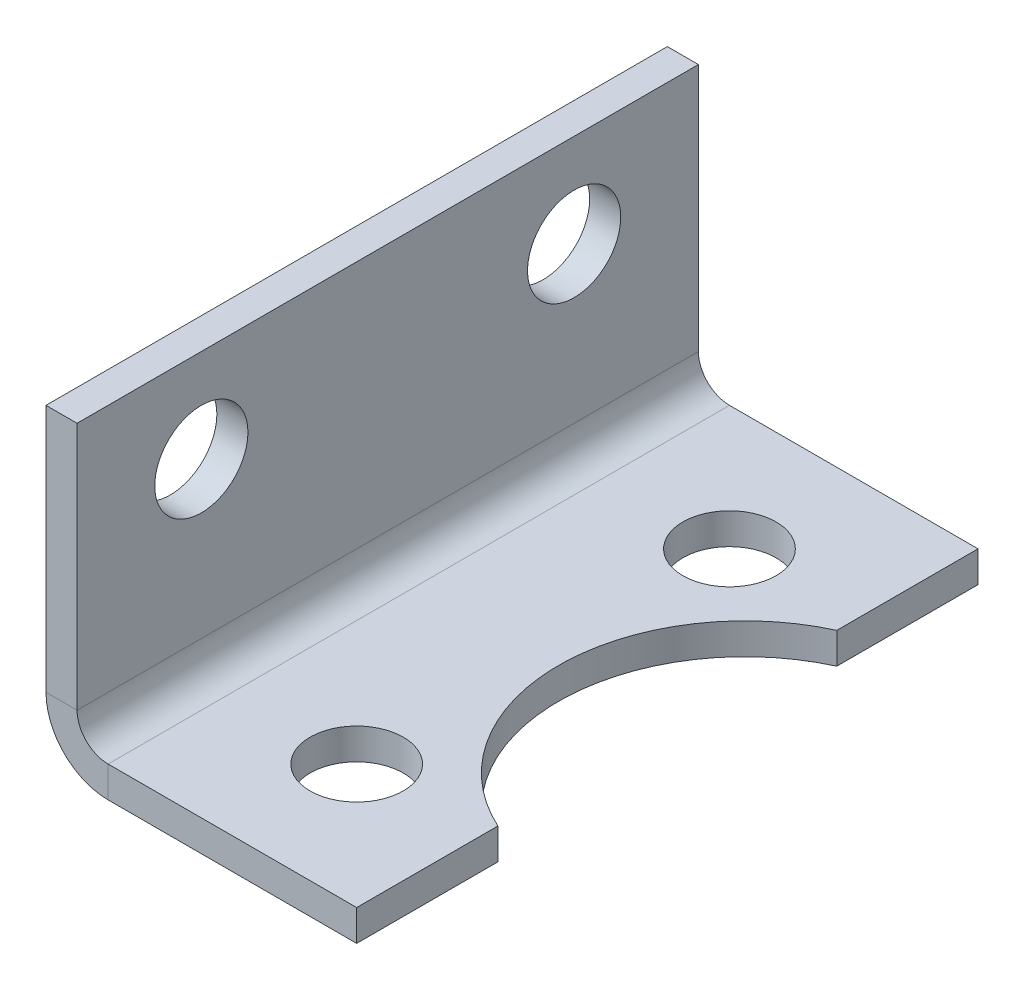
ISO-10303-21;
HEADER;
FILE_DESCRIPTION(('STEP AP214'),'2;1');
FILE_NAME('part.step','',(''),(''),'','','');
FILE_SCHEMA(('AUTOMOTIVE_DESIGN { 1 0 10303 214 1 1 1 1 }'));
ENDSEC;
DATA;
#1=APPLICATION_CONTEXT('core data for automotive mechanical design processes');
#2=APPLICATION_PROTOCOL_DEFINITION('international standard','automotive_design',2000,#1);
#3=PRODUCT_CONTEXT('',#1,'mechanical');
#4=PRODUCT('Part','Part','',(#3));
#5=PRODUCT_RELATED_PRODUCT_CATEGORY('part','',(#4));
#6=PRODUCT_DEFINITION_FORMATION('','',#4);
#7=PRODUCT_DEFINITION_CONTEXT('part definition',#1,'design');
#8=PRODUCT_DEFINITION('design','',#6,#7);
#9=PRODUCT_DEFINITION_SHAPE('','',#8);
#10=(LENGTH_UNIT() NAMED_UNIT(*) SI_UNIT(.MILLI.,.METRE.));
#11=(NAMED_UNIT(*) PLANE_ANGLE_UNIT() SI_UNIT($,.RADIAN.));
#12=(NAMED_UNIT(*) SI_UNIT($,.STERADIAN.) SOLID_ANGLE_UNIT());
#13=UNCERTAINTY_MEASURE_WITH_UNIT(LENGTH_MEASURE(1.E-05),#10,'distance_accuracy_value','');
#14=(GEOMETRIC_REPRESENTATION_CONTEXT(3) GLOBAL_UNCERTAINTY_ASSIGNED_CONTEXT((#13)) GLOBAL_UNIT_ASSIGNED_CONTEXT((#10,
#11,#12)) REPRESENTATION_CONTEXT('',''));
#15=CARTESIAN_POINT('',(0.,0.,0.));
#16=DIRECTION('',(0.,0.,1.));
#17=DIRECTION('',(1.,0.,0.));
#18=AXIS2_PLACEMENT_3D('',#15,#16,#17);
#19=CARTESIAN_POINT('',(18.,0.,40.));
#20=DIRECTION('',(1.,0.,0.));
#21=DIRECTION('',(0.,0.,-1.));
#22=AXIS2_PLACEMENT_3D('',#19,#20,#21);
#23=PLANE('',#22);
#24=DIRECTION('',(0.,1.,0.));
#25=VECTOR('',#24,1.);
#26=CARTESIAN_POINT('',(18.,-10.,9.09128788536431));
#27=LINE('',#26,#25);
#28=CARTESIAN_POINT('',(18.,-2.,9.09128788536431));
#29=VERTEX_POINT('',#28);
#30=CARTESIAN_POINT('',(18.,0.,9.09128788536431));
#31=VERTEX_POINT('',#30);
#32=EDGE_CURVE('E60',#29,#31,#27,.T.);
#33=ORIENTED_EDGE('',*,*,#32,.F.);
#34=DIRECTION('',(0.,0.,-1.));
#35=VECTOR('',#34,1.);
#36=CARTESIAN_POINT('',(18.,-2.,40.));
#37=LINE('',#36,#35);
#38=CARTESIAN_POINT('',(18.,-2.,0.));
#39=VERTEX_POINT('',#38);
#40=EDGE_CURVE('E191',#29,#39,#37,.T.);
#41=ORIENTED_EDGE('',*,*,#40,.T.);
#42=DIRECTION('',(0.,-1.,0.));
#43=VECTOR('',#42,1.);
#44=CARTESIAN_POINT('',(18.,0.,0.));
#45=LINE('',#44,#43);
#46=CARTESIAN_POINT('',(18.,0.,0.));
#47=VERTEX_POINT('',#46);
#48=EDGE_CURVE('E161',#47,#39,#45,.T.);
#49=ORIENTED_EDGE('',*,*,#48,.F.);
#50=DIRECTION('',(0.,0.,-1.));
#51=VECTOR('',#50,1.);
#52=CARTESIAN_POINT('',(18.,0.,40.));
#53=LINE('',#52,#51);
#54=EDGE_CURVE('E187',#31,#47,#53,.T.);
#55=ORIENTED_EDGE('',*,*,#54,.F.);
#56=EDGE_LOOP('',(#33,#41,#49,#55));
#57=FACE_BOUND('',#56,.T.);
#58=ADVANCED_FACE('F43',(#57),#23,.T.);
#59=CARTESIAN_POINT('',(2.,0.,40.));
#60=DIRECTION('',(0.,0.,1.));
#61=DIRECTION('',(1.,0.,0.));
#62=AXIS2_PLACEMENT_3D('',#59,#60,#61);
#63=PLANE('',#62);
#64=DIRECTION('',(0.,-1.,0.));
#65=VECTOR('',#64,1.);
#66=CARTESIAN_POINT('',(2.,0.,40.));
#67=LINE('',#66,#65);
#68=CARTESIAN_POINT('',(2.,0.,40.));
#69=VERTEX_POINT('',#68);
#70=CARTESIAN_POINT('',(2.,-2.,40.));
#71=VERTEX_POINT('',#70);
#72=EDGE_CURVE('E11',#69,#71,#67,.T.);
#73=ORIENTED_EDGE('',*,*,#72,.F.);
#74=CARTESIAN_POINT('',(2.,2.,40.));
#75=DIRECTION('',(0.,0.,-1.));
#76=DIRECTION('',(-1.,0.,0.));
#77=AXIS2_PLACEMENT_3D('',#74,#75,#76);
#78=CIRCLE('',#77,2.);
#79=CARTESIAN_POINT('',(0.,2.,40.));
#80=VERTEX_POINT('',#79);
#81=EDGE_CURVE('E152',#80,#69,#78,.F.);
#82=ORIENTED_EDGE('',*,*,#81,.F.);
#83=DIRECTION('',(1.,0.,0.));
#84=VECTOR('',#83,1.);
#85=CARTESIAN_POINT('',(-2.,2.,40.));
#86=LINE('',#85,#84);
#87=CARTESIAN_POINT('',(-2.,2.,40.));
#88=VERTEX_POINT('',#87);
#89=EDGE_CURVE('E52',#88,#80,#86,.T.);
#90=ORIENTED_EDGE('',*,*,#89,.F.);
#91=CARTESIAN_POINT('',(2.,2.,40.));
#92=DIRECTION('',(0.,0.,1.));
#93=DIRECTION('',(1.,0.,0.));
#94=AXIS2_PLACEMENT_3D('',#91,#92,#93);
#95=CIRCLE('',#94,4.);
#96=EDGE_CURVE('E145',#88,#71,#95,.T.);
#97=ORIENTED_EDGE('',*,*,#96,.T.);
#98=EDGE_LOOP('',(#73,#82,#90,#97));
#99=FACE_BOUND('',#98,.T.);
#100=ADVANCED_FACE('F45',(#99),#63,.T.);
#101=CARTESIAN_POINT('',(-2.,2.,40.));
#102=DIRECTION('',(0.,0.,1.));
#103=DIRECTION('',(1.,0.,0.));
#104=AXIS2_PLACEMENT_3D('',#101,#102,#103);
#105=PLANE('',#104);
#106=DIRECTION('',(1.,0.,0.));
#107=VECTOR('',#106,1.);
#108=CARTESIAN_POINT('',(0.,0.,40.));
#109=LINE('',#108,#107);
#110=CARTESIAN_POINT('',(18.,0.,40.));
#111=VERTEX_POINT('',#110);
#112=EDGE_CURVE('E219',#69,#111,#109,.T.);
#113=ORIENTED_EDGE('',*,*,#112,.F.);
#114=ORIENTED_EDGE('',*,*,#72,.T.);
#115=DIRECTION('',(1.,0.,0.));
#116=VECTOR('',#115,1.);
#117=CARTESIAN_POINT('',(0.,-2.,40.));
#118=LINE('',#117,#116);
#119=CARTESIAN_POINT('',(18.,-2.,40.));
#120=VERTEX_POINT('',#119);
#121=EDGE_CURVE('E107',#71,#120,#118,.T.);
#122=ORIENTED_EDGE('',*,*,#121,.T.);
#123=DIRECTION('',(0.,-1.,0.));
#124=VECTOR('',#123,1.);
#125=CARTESIAN_POINT('',(18.,0.,40.));
#126=LINE('',#125,#124);
#127=EDGE_CURVE('E216',#111,#120,#126,.T.);
#128=ORIENTED_EDGE('',*,*,#127,.F.);
#129=EDGE_LOOP('',(#113,#114,#122,#128));
#130=FACE_BOUND('',#129,.T.);
#131=ADVANCED_FACE('F240',(#130),#105,.T.);
#132=CARTESIAN_POINT('',(0.,2.,0.));
#133=DIRECTION('',(0.,0.,-1.));
#134=DIRECTION('',(-1.,0.,0.));
#135=AXIS2_PLACEMENT_3D('',#132,#133,#134);
#136=PLANE('',#135);
#137=DIRECTION('',(-1.,0.,0.));
#138=VECTOR('',#137,1.);
#139=CARTESIAN_POINT('',(0.,2.,0.));
#140=LINE('',#139,#138);
#141=CARTESIAN_POINT('',(0.,2.,0.));
#142=VERTEX_POINT('',#141);
#143=CARTESIAN_POINT('',(-2.,2.,0.));
#144=VERTEX_POINT('',#143);
#145=EDGE_CURVE('E196',#142,#144,#140,.T.);
#146=ORIENTED_EDGE('',*,*,#145,.F.);
#147=CARTESIAN_POINT('',(2.,2.,0.));
#148=DIRECTION('',(0.,0.,-1.));
#149=DIRECTION('',(-1.,0.,0.));
#150=AXIS2_PLACEMENT_3D('',#147,#148,#149);
#151=CIRCLE('',#150,2.);
#152=CARTESIAN_POINT('',(2.,0.,0.));
#153=VERTEX_POINT('',#152);
#154=EDGE_CURVE('E167',#142,#153,#151,.F.);
#155=ORIENTED_EDGE('',*,*,#154,.T.);
#156=DIRECTION('',(0.,1.,0.));
#157=VECTOR('',#156,1.);
#158=CARTESIAN_POINT('',(2.,-2.,0.));
#159=LINE('',#158,#157);
#160=CARTESIAN_POINT('',(2.,-2.,0.));
#161=VERTEX_POINT('',#160);
#162=EDGE_CURVE('E101',#161,#153,#159,.T.);
#163=ORIENTED_EDGE('',*,*,#162,.F.);
#164=CARTESIAN_POINT('',(2.,2.,0.));
#165=DIRECTION('',(0.,0.,1.));
#166=DIRECTION('',(1.,0.,0.));
#167=AXIS2_PLACEMENT_3D('',#164,#165,#166);
#168=CIRCLE('',#167,4.);
#169=EDGE_CURVE('E175',#144,#161,#168,.T.);
#170=ORIENTED_EDGE('',*,*,#169,.F.);
#171=EDGE_LOOP('',(#146,#155,#163,#170));
#172=FACE_BOUND('',#171,.T.);
#173=ADVANCED_FACE('F238',(#172),#136,.T.);
#174=CARTESIAN_POINT('',(2.,-2.,0.));
#175=DIRECTION('',(0.,0.,-1.));
#176=DIRECTION('',(-1.,0.,0.));
#177=AXIS2_PLACEMENT_3D('',#174,#175,#176);
#178=PLANE('',#177);
#179=DIRECTION('',(0.,-1.,0.));
#180=VECTOR('',#179,1.);
#181=CARTESIAN_POINT('',(0.,18.,0.));
#182=LINE('',#181,#180);
#183=CARTESIAN_POINT('',(0.,18.,0.));
#184=VERTEX_POINT('',#183);
#185=EDGE_CURVE('E169',#184,#142,#182,.T.);
#186=ORIENTED_EDGE('',*,*,#185,.T.);
#187=ORIENTED_EDGE('',*,*,#145,.T.);
#188=DIRECTION('',(0.,-1.,0.));
#189=VECTOR('',#188,1.);
#190=CARTESIAN_POINT('',(-2.,18.,0.));
#191=LINE('',#190,#189);
#192=CARTESIAN_POINT('',(-2.,18.,0.));
#193=VERTEX_POINT('',#192);
#194=EDGE_CURVE('E173',#193,#144,#191,.T.);
#195=ORIENTED_EDGE('',*,*,#194,.F.);
#196=DIRECTION('',(1.,0.,0.));
#197=VECTOR('',#196,1.);
#198=CARTESIAN_POINT('',(-2.,18.,0.));
#199=LINE('',#198,#197);
#200=EDGE_CURVE('E131',#193,#184,#199,.T.);
#201=ORIENTED_EDGE('',*,*,#200,.T.);
#202=EDGE_LOOP('',(#186,#187,#195,#201));
#203=FACE_BOUND('',#202,.T.);
#204=ADVANCED_FACE('F234',(#203),#178,.T.);
#205=CARTESIAN_POINT('',(0.,-2.,40.));
#206=DIRECTION('',(0.,1.,0.));
#207=DIRECTION('',(0.,0.,1.));
#208=AXIS2_PLACEMENT_3D('',#205,#206,#207);
#209=PLANE('',#208);
#210=CARTESIAN_POINT('',(10.,-2.,8.));
#211=DIRECTION('',(0.,1.,0.));
#212=DIRECTION('',(0.,0.,1.));
#213=AXIS2_PLACEMENT_3D('',#210,#211,#212);
#214=CIRCLE('',#213,3.);
#215=CARTESIAN_POINT('',(10.,-2.,11.));
#216=VERTEX_POINT('',#215);
#217=EDGE_CURVE('E210',#216,#216,#214,.T.);
#218=ORIENTED_EDGE('',*,*,#217,.T.);
#219=EDGE_LOOP('',(#218));
#220=FACE_BOUND('',#219,.T.);
#221=CARTESIAN_POINT('',(10.,-2.,32.));
#222=DIRECTION('',(0.,1.,0.));
#223=DIRECTION('',(0.,0.,1.));
#224=AXIS2_PLACEMENT_3D('',#221,#222,#223);
#225=CIRCLE('',#224,3.);
#226=CARTESIAN_POINT('',(10.,-2.,35.));
#227=VERTEX_POINT('',#226);
#228=EDGE_CURVE('E285',#227,#227,#225,.T.);
#229=ORIENTED_EDGE('',*,*,#228,.T.);
#230=EDGE_LOOP('',(#229));
#231=FACE_BOUND('',#230,.T.);
#232=ORIENTED_EDGE('',*,*,#40,.F.);
#233=CARTESIAN_POINT('',(23.,-2.,20.));
#234=DIRECTION('',(0.,1.,0.));
#235=DIRECTION('',(0.,0.,1.));
#236=AXIS2_PLACEMENT_3D('',#233,#234,#235);
#237=CIRCLE('',#236,12.);
#238=CARTESIAN_POINT('',(18.,-2.,30.9087121146357));
#239=VERTEX_POINT('',#238);
#240=EDGE_CURVE('E273',#29,#239,#237,.T.);
#241=ORIENTED_EDGE('',*,*,#240,.T.);
#242=EDGE_CURVE('E192',#120,#239,#37,.T.);
#243=ORIENTED_EDGE('',*,*,#242,.F.);
#244=ORIENTED_EDGE('',*,*,#121,.F.);
#245=DIRECTION('',(0.,0.,-1.));
#246=VECTOR('',#245,1.);
#247=CARTESIAN_POINT('',(2.,-2.,40.));
#248=LINE('',#247,#246);
#249=EDGE_CURVE('E157',#71,#161,#248,.T.);
#250=ORIENTED_EDGE('',*,*,#249,.T.);
#251=DIRECTION('',(1.,0.,0.));
#252=VECTOR('',#251,1.);
#253=CARTESIAN_POINT('',(0.,-2.,0.));
#254=LINE('',#253,#252);
#255=EDGE_CURVE('E158',#161,#39,#254,.T.);
#256=ORIENTED_EDGE('',*,*,#255,.T.);
#257=EDGE_LOOP('',(#232,#241,#243,#244,#250,#256));
#258=FACE_BOUND('',#257,.T.);
#259=ADVANCED_FACE('F246',(#220,#231,#258),#209,.F.);
#260=DIRECTION('',(0.,1.,0.));
#261=VECTOR('',#260,1.);
#262=CARTESIAN_POINT('',(18.,-10.,30.9087121146357));
#263=LINE('',#262,#261);
#264=CARTESIAN_POINT('',(18.,0.,30.9087121146357));
#265=VERTEX_POINT('',#264);
#266=EDGE_CURVE('E269',#265,#239,#263,.F.);
#267=ORIENTED_EDGE('',*,*,#266,.F.);
#268=EDGE_CURVE('E188',#111,#265,#53,.T.);
#269=ORIENTED_EDGE('',*,*,#268,.F.);
#270=ORIENTED_EDGE('',*,*,#127,.T.);
#271=ORIENTED_EDGE('',*,*,#242,.T.);
#272=EDGE_LOOP('',(#267,#269,#270,#271));
#273=FACE_BOUND('',#272,.T.);
#274=ADVANCED_FACE('F251',(#273),#23,.T.);
#275=CARTESIAN_POINT('',(0.,0.,40.));
#276=DIRECTION('',(0.,1.,0.));
#277=DIRECTION('',(0.,0.,1.));
#278=AXIS2_PLACEMENT_3D('',#275,#276,#277);
#279=PLANE('',#278);
#280=CARTESIAN_POINT('',(10.,0.,8.));
#281=DIRECTION('',(0.,1.,0.));
#282=DIRECTION('',(0.,0.,1.));
#283=AXIS2_PLACEMENT_3D('',#280,#281,#282);
#284=CIRCLE('',#283,3.);
#285=CARTESIAN_POINT('',(10.,0.,11.));
#286=VERTEX_POINT('',#285);
#287=EDGE_CURVE('E519',#286,#286,#284,.T.);
#288=ORIENTED_EDGE('',*,*,#287,.F.);
#289=EDGE_LOOP('',(#288));
#290=FACE_BOUND('',#289,.T.);
#291=CARTESIAN_POINT('',(10.,0.,32.));
#292=DIRECTION('',(0.,1.,0.));
#293=DIRECTION('',(0.,0.,1.));
#294=AXIS2_PLACEMENT_3D('',#291,#292,#293);
#295=CIRCLE('',#294,3.);
#296=CARTESIAN_POINT('',(10.,0.,35.));
#297=VERTEX_POINT('',#296);
#298=EDGE_CURVE('E520',#297,#297,#295,.T.);
#299=ORIENTED_EDGE('',*,*,#298,.F.);
#300=EDGE_LOOP('',(#299));
#301=FACE_BOUND('',#300,.T.);
#302=CARTESIAN_POINT('',(23.,0.,20.));
#303=DIRECTION('',(0.,1.,0.));
#304=DIRECTION('',(0.,0.,1.));
#305=AXIS2_PLACEMENT_3D('',#302,#303,#304);
#306=CIRCLE('',#305,12.);
#307=EDGE_CURVE('E274',#31,#265,#306,.T.);
#308=ORIENTED_EDGE('',*,*,#307,.F.);
#309=ORIENTED_EDGE('',*,*,#54,.T.);
#310=DIRECTION('',(1.,0.,0.));
#311=VECTOR('',#310,1.);
#312=CARTESIAN_POINT('',(0.,0.,0.));
#313=LINE('',#312,#311);
#314=EDGE_CURVE('E164',#153,#47,#313,.T.);
#315=ORIENTED_EDGE('',*,*,#314,.F.);
#316=DIRECTION('',(0.,0.,-1.));
#317=VECTOR('',#316,1.);
#318=CARTESIAN_POINT('',(2.,0.,40.));
#319=LINE('',#318,#317);
#320=EDGE_CURVE('E184',#69,#153,#319,.T.);
#321=ORIENTED_EDGE('',*,*,#320,.F.);
#322=ORIENTED_EDGE('',*,*,#112,.T.);
#323=ORIENTED_EDGE('',*,*,#268,.T.);
#324=EDGE_LOOP('',(#308,#309,#315,#321,#322,#323));
#325=FACE_BOUND('',#324,.T.);
#326=ADVANCED_FACE('F258',(#290,#301,#325),#279,.T.);
#327=CARTESIAN_POINT('',(2.,2.,40.));
#328=DIRECTION('',(0.,0.,-1.));
#329=DIRECTION('',(-1.,0.,0.));
#330=AXIS2_PLACEMENT_3D('',#327,#328,#329);
#331=CYLINDRICAL_SURFACE('',#330,2.);
#332=ORIENTED_EDGE('',*,*,#154,.F.);
#333=DIRECTION('',(0.,0.,-1.));
#334=VECTOR('',#333,1.);
#335=CARTESIAN_POINT('',(0.,2.,40.));
#336=LINE('',#335,#334);
#337=EDGE_CURVE('E181',#80,#142,#336,.T.);
#338=ORIENTED_EDGE('',*,*,#337,.F.);
#339=ORIENTED_EDGE('',*,*,#81,.T.);
#340=ORIENTED_EDGE('',*,*,#320,.T.);
#341=EDGE_LOOP('',(#332,#338,#339,#340));
#342=FACE_BOUND('',#341,.T.);
#343=ADVANCED_FACE('F226',(#342),#331,.F.);
#344=CARTESIAN_POINT('',(0.,18.,40.));
#345=DIRECTION('',(1.,0.,0.));
#346=DIRECTION('',(0.,1.,0.));
#347=AXIS2_PLACEMENT_3D('',#344,#345,#346);
#348=PLANE('',#347);
#349=CARTESIAN_POINT('',(0.,12.,32.));
#350=DIRECTION('',(1.,0.,0.));
#351=DIRECTION('',(0.,0.,-1.));
#352=AXIS2_PLACEMENT_3D('',#349,#350,#351);
#353=CIRCLE('',#352,3.);
#354=CARTESIAN_POINT('',(0.,12.,29.));
#355=VERTEX_POINT('',#354);
#356=EDGE_CURVE('E200',#355,#355,#353,.T.);
#357=ORIENTED_EDGE('',*,*,#356,.F.);
#358=EDGE_LOOP('',(#357));
#359=FACE_BOUND('',#358,.T.);
#360=CARTESIAN_POINT('',(0.,12.,8.));
#361=DIRECTION('',(1.,0.,0.));
#362=DIRECTION('',(0.,0.,-1.));
#363=AXIS2_PLACEMENT_3D('',#360,#361,#362);
#364=CIRCLE('',#363,3.);
#365=CARTESIAN_POINT('',(0.,12.,5.));
#366=VERTEX_POINT('',#365);
#367=EDGE_CURVE('E205',#366,#366,#364,.T.);
#368=ORIENTED_EDGE('',*,*,#367,.F.);
#369=EDGE_LOOP('',(#368));
#370=FACE_BOUND('',#369,.T.);
#371=ORIENTED_EDGE('',*,*,#185,.F.);
#372=DIRECTION('',(0.,0.,-1.));
#373=VECTOR('',#372,1.);
#374=CARTESIAN_POINT('',(0.,18.,40.));
#375=LINE('',#374,#373);
#376=CARTESIAN_POINT('',(0.,18.,40.));
#377=VERTEX_POINT('',#376);
#378=EDGE_CURVE('E135',#377,#184,#375,.T.);
#379=ORIENTED_EDGE('',*,*,#378,.F.);
#380=DIRECTION('',(0.,-1.,0.));
#381=VECTOR('',#380,1.);
#382=CARTESIAN_POINT('',(0.,18.,40.));
#383=LINE('',#382,#381);
#384=EDGE_CURVE('E150',#377,#80,#383,.T.);
#385=ORIENTED_EDGE('',*,*,#384,.T.);
#386=ORIENTED_EDGE('',*,*,#337,.T.);
#387=EDGE_LOOP('',(#371,#379,#385,#386));
#388=FACE_BOUND('',#387,.T.);
#389=ADVANCED_FACE('F232',(#359,#370,#388),#348,.T.);
#390=CARTESIAN_POINT('',(-2.,18.,40.));
#391=DIRECTION('',(0.,1.,0.));
#392=DIRECTION('',(0.,0.,1.));
#393=AXIS2_PLACEMENT_3D('',#390,#391,#392);
#394=PLANE('',#393);
#395=ORIENTED_EDGE('',*,*,#200,.F.);
#396=DIRECTION('',(0.,0.,-1.));
#397=VECTOR('',#396,1.);
#398=CARTESIAN_POINT('',(-2.,18.,40.));
#399=LINE('',#398,#397);
#400=CARTESIAN_POINT('',(-2.,18.,40.));
#401=VERTEX_POINT('',#400);
#402=EDGE_CURVE('E125',#401,#193,#399,.T.);
#403=ORIENTED_EDGE('',*,*,#402,.F.);
#404=DIRECTION('',(1.,0.,0.));
#405=VECTOR('',#404,1.);
#406=CARTESIAN_POINT('',(-2.,18.,40.));
#407=LINE('',#406,#405);
#408=EDGE_CURVE('E129',#401,#377,#407,.T.);
#409=ORIENTED_EDGE('',*,*,#408,.T.);
#410=ORIENTED_EDGE('',*,*,#378,.T.);
#411=EDGE_LOOP('',(#395,#403,#409,#410));
#412=FACE_BOUND('',#411,.T.);
#413=ADVANCED_FACE('F127',(#412),#394,.T.);
#414=CARTESIAN_POINT('',(-2.,18.,40.));
#415=DIRECTION('',(1.,0.,0.));
#416=DIRECTION('',(0.,1.,0.));
#417=AXIS2_PLACEMENT_3D('',#414,#415,#416);
#418=PLANE('',#417);
#419=CARTESIAN_POINT('',(-2.,12.,32.));
#420=DIRECTION('',(1.,0.,0.));
#421=DIRECTION('',(0.,1.,0.));
#422=AXIS2_PLACEMENT_3D('',#419,#420,#421);
#423=CIRCLE('',#422,3.);
#424=CARTESIAN_POINT('',(-2.,15.,32.));
#425=VERTEX_POINT('',#424);
#426=EDGE_CURVE('E47',#425,#425,#423,.T.);
#427=ORIENTED_EDGE('',*,*,#426,.T.);
#428=EDGE_LOOP('',(#427));
#429=FACE_BOUND('',#428,.T.);
#430=CARTESIAN_POINT('',(-2.,12.,8.));
#431=DIRECTION('',(1.,0.,0.));
#432=DIRECTION('',(0.,1.,0.));
#433=AXIS2_PLACEMENT_3D('',#430,#431,#432);
#434=CIRCLE('',#433,3.);
#435=CARTESIAN_POINT('',(-2.,15.,8.));
#436=VERTEX_POINT('',#435);
#437=EDGE_CURVE('E198',#436,#436,#434,.T.);
#438=ORIENTED_EDGE('',*,*,#437,.T.);
#439=EDGE_LOOP('',(#438));
#440=FACE_BOUND('',#439,.T.);
#441=ORIENTED_EDGE('',*,*,#194,.T.);
#442=DIRECTION('',(0.,0.,-1.));
#443=VECTOR('',#442,1.);
#444=CARTESIAN_POINT('',(-2.,2.,40.));
#445=LINE('',#444,#443);
#446=EDGE_CURVE('E136',#88,#144,#445,.T.);
#447=ORIENTED_EDGE('',*,*,#446,.F.);
#448=DIRECTION('',(0.,-1.,0.));
#449=VECTOR('',#448,1.);
#450=CARTESIAN_POINT('',(-2.,18.,40.));
#451=LINE('',#450,#449);
#452=EDGE_CURVE('E140',#401,#88,#451,.T.);
#453=ORIENTED_EDGE('',*,*,#452,.F.);
#454=ORIENTED_EDGE('',*,*,#402,.T.);
#455=EDGE_LOOP('',(#441,#447,#453,#454));
#456=FACE_BOUND('',#455,.T.);
#457=ADVANCED_FACE('F141',(#429,#440,#456),#418,.F.);
#458=CARTESIAN_POINT('',(2.,2.,40.));
#459=DIRECTION('',(0.,0.,-1.));
#460=DIRECTION('',(-1.,0.,0.));
#461=AXIS2_PLACEMENT_3D('',#458,#459,#460);
#462=CYLINDRICAL_SURFACE('',#461,4.);
#463=ORIENTED_EDGE('',*,*,#169,.T.);
#464=ORIENTED_EDGE('',*,*,#249,.F.);
#465=ORIENTED_EDGE('',*,*,#96,.F.);
#466=ORIENTED_EDGE('',*,*,#446,.T.);
#467=EDGE_LOOP('',(#463,#464,#465,#466));
#468=FACE_BOUND('',#467,.T.);
#469=ADVANCED_FACE('F236',(#468),#462,.T.);
#470=CARTESIAN_POINT('',(2.,2.,40.));
#471=DIRECTION('',(0.,0.,-1.));
#472=DIRECTION('',(-1.,0.,0.));
#473=AXIS2_PLACEMENT_3D('',#470,#471,#472);
#474=PLANE('',#473);
#475=ORIENTED_EDGE('',*,*,#452,.T.);
#476=ORIENTED_EDGE('',*,*,#89,.T.);
#477=ORIENTED_EDGE('',*,*,#384,.F.);
#478=ORIENTED_EDGE('',*,*,#408,.F.);
#479=EDGE_LOOP('',(#475,#476,#477,#478));
#480=FACE_BOUND('',#479,.T.);
#481=ADVANCED_FACE('F148',(#480),#474,.F.);
#482=CARTESIAN_POINT('',(2.,2.,0.));
#483=DIRECTION('',(0.,0.,-1.));
#484=DIRECTION('',(-1.,0.,0.));
#485=AXIS2_PLACEMENT_3D('',#482,#483,#484);
#486=PLANE('',#485);
#487=ORIENTED_EDGE('',*,*,#255,.F.);
#488=ORIENTED_EDGE('',*,*,#162,.T.);
#489=ORIENTED_EDGE('',*,*,#314,.T.);
#490=ORIENTED_EDGE('',*,*,#48,.T.);
#491=EDGE_LOOP('',(#487,#488,#489,#490));
#492=FACE_BOUND('',#491,.T.);
#493=ADVANCED_FACE('F281',(#492),#486,.T.);
#494=CARTESIAN_POINT('',(-10.,12.,8.));
#495=DIRECTION('',(1.,0.,0.));
#496=DIRECTION('',(0.,0.,-1.));
#497=AXIS2_PLACEMENT_3D('',#494,#495,#496);
#498=CYLINDRICAL_SURFACE('',#497,3.);
#499=ORIENTED_EDGE('',*,*,#367,.T.);
#500=EDGE_LOOP('',(#499));
#501=FACE_BOUND('',#500,.T.);
#502=ORIENTED_EDGE('',*,*,#437,.F.);
#503=EDGE_LOOP('',(#502));
#504=FACE_BOUND('',#503,.T.);
#505=ADVANCED_FACE('F312',(#501,#504),#498,.F.);
#506=CARTESIAN_POINT('',(-10.,12.,32.));
#507=DIRECTION('',(1.,0.,0.));
#508=DIRECTION('',(0.,0.,-1.));
#509=AXIS2_PLACEMENT_3D('',#506,#507,#508);
#510=CYLINDRICAL_SURFACE('',#509,3.);
#511=ORIENTED_EDGE('',*,*,#356,.T.);
#512=EDGE_LOOP('',(#511));
#513=FACE_BOUND('',#512,.T.);
#514=ORIENTED_EDGE('',*,*,#426,.F.);
#515=EDGE_LOOP('',(#514));
#516=FACE_BOUND('',#515,.T.);
#517=ADVANCED_FACE('F309',(#513,#516),#510,.F.);
#518=CARTESIAN_POINT('',(23.,-10.,20.));
#519=DIRECTION('',(0.,1.,0.));
#520=DIRECTION('',(0.,0.,1.));
#521=AXIS2_PLACEMENT_3D('',#518,#519,#520);
#522=CYLINDRICAL_SURFACE('',#521,12.);
#523=ORIENTED_EDGE('',*,*,#32,.T.);
#524=ORIENTED_EDGE('',*,*,#307,.T.);
#525=ORIENTED_EDGE('',*,*,#266,.T.);
#526=ORIENTED_EDGE('',*,*,#240,.F.);
#527=EDGE_LOOP('',(#523,#524,#525,#526));
#528=FACE_BOUND('',#527,.T.);
#529=ADVANCED_FACE('F302',(#528),#522,.F.);
#530=CARTESIAN_POINT('',(10.,-10.,32.));
#531=DIRECTION('',(0.,1.,0.));
#532=DIRECTION('',(0.,0.,1.));
#533=AXIS2_PLACEMENT_3D('',#530,#531,#532);
#534=CYLINDRICAL_SURFACE('',#533,3.);
#535=ORIENTED_EDGE('',*,*,#298,.T.);
#536=EDGE_LOOP('',(#535));
#537=FACE_BOUND('',#536,.T.);
#538=ORIENTED_EDGE('',*,*,#228,.F.);
#539=EDGE_LOOP('',(#538));
#540=FACE_BOUND('',#539,.T.);
#541=ADVANCED_FACE('F296',(#537,#540),#534,.F.);
#542=CARTESIAN_POINT('',(10.,-10.,8.));
#543=DIRECTION('',(0.,1.,0.));
#544=DIRECTION('',(0.,0.,1.));
#545=AXIS2_PLACEMENT_3D('',#542,#543,#544);
#546=CYLINDRICAL_SURFACE('',#545,3.);
#547=ORIENTED_EDGE('',*,*,#287,.T.);
#548=EDGE_LOOP('',(#547));
#549=FACE_BOUND('',#548,.T.);
#550=ORIENTED_EDGE('',*,*,#217,.F.);
#551=EDGE_LOOP('',(#550));
#552=FACE_BOUND('',#551,.T.);
#553=ADVANCED_FACE('F294',(#549,#552),#546,.F.);
#554=CLOSED_SHELL('',(#58,#100,#131,#173,#204,#259,#274,#326,#343,#389,#413,#457,#469,#481,#493,
#505,#517,#529,#541,#553));
#555=MANIFOLD_SOLID_BREP('B2',#554);
#556=ADVANCED_BREP_SHAPE_REPRESENTATION('',(#18,#555),#14);
#557=SHAPE_DEFINITION_REPRESENTATION(#9,#556);
ENDSEC;
END-ISO-10303-21;
